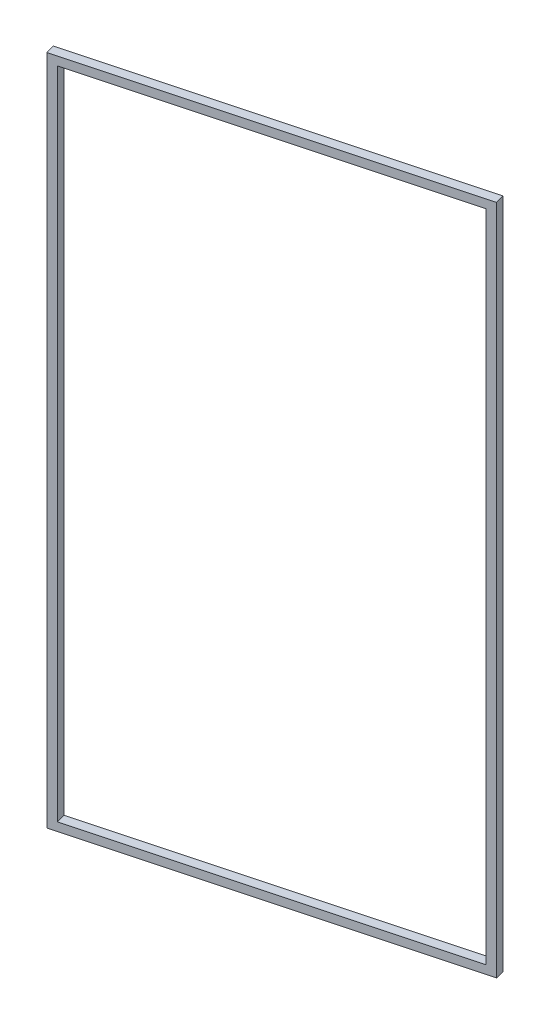
ISO-10303-21;
HEADER;
FILE_DESCRIPTION(('STEP AP214'),'2;1');
FILE_NAME('part.step','',(''),(''),'','','');
FILE_SCHEMA(('AUTOMOTIVE_DESIGN { 1 0 10303 214 1 1 1 1 }'));
ENDSEC;
DATA;
#1=APPLICATION_CONTEXT('core data for automotive mechanical design processes');
#2=APPLICATION_PROTOCOL_DEFINITION('international standard','automotive_design',2000,#1);
#3=PRODUCT_CONTEXT('',#1,'mechanical');
#4=PRODUCT('Part','Part','',(#3));
#5=PRODUCT_RELATED_PRODUCT_CATEGORY('part','',(#4));
#6=PRODUCT_DEFINITION_FORMATION('','',#4);
#7=PRODUCT_DEFINITION_CONTEXT('part definition',#1,'design');
#8=PRODUCT_DEFINITION('design','',#6,#7);
#9=PRODUCT_DEFINITION_SHAPE('','',#8);
#10=(LENGTH_UNIT() NAMED_UNIT(*) SI_UNIT(.MILLI.,.METRE.));
#11=(NAMED_UNIT(*) PLANE_ANGLE_UNIT() SI_UNIT($,.RADIAN.));
#12=(NAMED_UNIT(*) SI_UNIT($,.STERADIAN.) SOLID_ANGLE_UNIT());
#13=UNCERTAINTY_MEASURE_WITH_UNIT(LENGTH_MEASURE(1.E-05),#10,'distance_accuracy_value','');
#14=(GEOMETRIC_REPRESENTATION_CONTEXT(3) GLOBAL_UNCERTAINTY_ASSIGNED_CONTEXT((#13)) GLOBAL_UNIT_ASSIGNED_CONTEXT((#10,
#11,#12)) REPRESENTATION_CONTEXT('',''));
#15=CARTESIAN_POINT('',(0.,0.,0.));
#16=DIRECTION('',(0.,0.,1.));
#17=DIRECTION('',(1.,0.,0.));
#18=AXIS2_PLACEMENT_3D('',#15,#16,#17);
#19=CARTESIAN_POINT('',(-634.689419846,-1202.,2942.296134476));
#20=DIRECTION('',(0.258819045102985,0.,0.965925826288944));
#21=DIRECTION('',(0.,-1.,0.));
#22=AXIS2_PLACEMENT_3D('',#19,#20,#21);
#23=PLANE('',#22);
#24=DIRECTION('',(0.,-1.,0.));
#25=VECTOR('',#24,1.);
#26=CARTESIAN_POINT('',(-1235.012320885,-40.,3103.152171008));
#27=LINE('',#26,#25);
#28=CARTESIAN_POINT('',(-1235.012320885,-40.,3103.152171008));
#29=VERTEX_POINT('',#28);
#30=CARTESIAN_POINT('',(-1235.012320885,-2364.,3103.152171008));
#31=VERTEX_POINT('',#30);
#32=EDGE_CURVE('E158',#29,#31,#27,.T.);
#33=ORIENTED_EDGE('',*,*,#32,.F.);
#34=DIRECTION('',(-0.965925826288944,0.,0.258819045102985));
#35=VECTOR('',#34,1.);
#36=CARTESIAN_POINT('',(-34.36651880737,-40.,2781.440097945));
#37=LINE('',#36,#35);
#38=CARTESIAN_POINT('',(-34.36651880737,-40.,2781.440097945));
#39=VERTEX_POINT('',#38);
#40=EDGE_CURVE('E154',#39,#29,#37,.T.);
#41=ORIENTED_EDGE('',*,*,#40,.F.);
#42=DIRECTION('',(0.,1.,0.));
#43=VECTOR('',#42,1.);
#44=CARTESIAN_POINT('',(-34.36651880737,-2364.,2781.440097945));
#45=LINE('',#44,#43);
#46=CARTESIAN_POINT('',(-34.36651880737,-2364.,2781.440097945));
#47=VERTEX_POINT('',#46);
#48=EDGE_CURVE('E189',#47,#39,#45,.T.);
#49=ORIENTED_EDGE('',*,*,#48,.F.);
#50=DIRECTION('',(0.965925826288944,0.,-0.258819045102985));
#51=VECTOR('',#50,1.);
#52=CARTESIAN_POINT('',(-1235.012320885,-2364.,3103.152171008));
#53=LINE('',#52,#51);
#54=EDGE_CURVE('E21',#31,#47,#53,.T.);
#55=ORIENTED_EDGE('',*,*,#54,.F.);
#56=EDGE_LOOP('',(#33,#41,#49,#55));
#57=FACE_BOUND('',#56,.T.);
#58=DIRECTION('',(0.965925826288944,0.,-0.258819045102985));
#59=VECTOR('',#58,1.);
#60=CARTESIAN_POINT('',(-1263.990095673,-2394.,3110.916742361));
#61=LINE('',#60,#59);
#62=CARTESIAN_POINT('',(-1263.990095673,-2394.,3110.916742361));
#63=VERTEX_POINT('',#62);
#64=CARTESIAN_POINT('',(-5.388744018699,-2394.,2773.675526592));
#65=VERTEX_POINT('',#64);
#66=EDGE_CURVE('E124',#63,#65,#61,.T.);
#67=ORIENTED_EDGE('',*,*,#66,.T.);
#68=DIRECTION('',(0.,1.,0.));
#69=VECTOR('',#68,1.);
#70=CARTESIAN_POINT('',(-5.388744018699,-2394.,2773.675526592));
#71=LINE('',#70,#69);
#72=CARTESIAN_POINT('',(-5.388744018699,-10.,2773.675526592));
#73=VERTEX_POINT('',#72);
#74=EDGE_CURVE('E142',#65,#73,#71,.T.);
#75=ORIENTED_EDGE('',*,*,#74,.T.);
#76=DIRECTION('',(-0.965925826288944,0.,0.258819045102985));
#77=VECTOR('',#76,1.);
#78=CARTESIAN_POINT('',(-5.388744018699,-10.,2773.675526592));
#79=LINE('',#78,#77);
#80=CARTESIAN_POINT('',(-1263.990095673,-10.,3110.916742361));
#81=VERTEX_POINT('',#80);
#82=EDGE_CURVE('E116',#73,#81,#79,.T.);
#83=ORIENTED_EDGE('',*,*,#82,.T.);
#84=DIRECTION('',(0.,-1.,0.));
#85=VECTOR('',#84,1.);
#86=CARTESIAN_POINT('',(-1263.990095673,-10.,3110.916742361));
#87=LINE('',#86,#85);
#88=EDGE_CURVE('E115',#81,#63,#87,.T.);
#89=ORIENTED_EDGE('',*,*,#88,.T.);
#90=EDGE_LOOP('',(#67,#75,#83,#89));
#91=FACE_BOUND('',#90,.T.);
#92=ADVANCED_FACE('F17',(#57,#91),#23,.T.);
#93=CARTESIAN_POINT('',(-643.2304483344,-1202.,2910.420582209));
#94=DIRECTION('',(0.258819045102985,0.,0.965925826288944));
#95=DIRECTION('',(0.,-1.,0.));
#96=AXIS2_PLACEMENT_3D('',#93,#94,#95);
#97=PLANE('',#96);
#98=DIRECTION('',(0.965925826288944,0.,-0.258819045102985));
#99=VECTOR('',#98,1.);
#100=CARTESIAN_POINT('',(-1243.553349373,-2364.,3071.27661874));
#101=LINE('',#100,#99);
#102=CARTESIAN_POINT('',(-1243.553349373,-2364.,3071.27661874));
#103=VERTEX_POINT('',#102);
#104=CARTESIAN_POINT('',(-42.90754729575,-2364.,2749.564545678));
#105=VERTEX_POINT('',#104);
#106=EDGE_CURVE('E11',#103,#105,#101,.T.);
#107=ORIENTED_EDGE('',*,*,#106,.T.);
#108=DIRECTION('',(0.,1.,0.));
#109=VECTOR('',#108,1.);
#110=CARTESIAN_POINT('',(-42.90754729575,-2364.,2749.564545678));
#111=LINE('',#110,#109);
#112=CARTESIAN_POINT('',(-42.90754729575,-40.,2749.564545678));
#113=VERTEX_POINT('',#112);
#114=EDGE_CURVE('E191',#105,#113,#111,.T.);
#115=ORIENTED_EDGE('',*,*,#114,.T.);
#116=DIRECTION('',(-0.965925826288944,0.,0.258819045102985));
#117=VECTOR('',#116,1.);
#118=CARTESIAN_POINT('',(-42.90754729575,-40.,2749.564545678));
#119=LINE('',#118,#117);
#120=CARTESIAN_POINT('',(-1243.553349373,-40.,3071.27661874));
#121=VERTEX_POINT('',#120);
#122=EDGE_CURVE('E150',#113,#121,#119,.T.);
#123=ORIENTED_EDGE('',*,*,#122,.T.);
#124=DIRECTION('',(0.,-1.,0.));
#125=VECTOR('',#124,1.);
#126=CARTESIAN_POINT('',(-1243.553349373,-40.,3071.27661874));
#127=LINE('',#126,#125);
#128=EDGE_CURVE('E166',#121,#103,#127,.T.);
#129=ORIENTED_EDGE('',*,*,#128,.T.);
#130=EDGE_LOOP('',(#107,#115,#123,#129));
#131=FACE_BOUND('',#130,.T.);
#132=DIRECTION('',(0.,-1.,0.));
#133=VECTOR('',#132,1.);
#134=CARTESIAN_POINT('',(-1272.531124162,-10.,3079.041190093));
#135=LINE('',#134,#133);
#136=CARTESIAN_POINT('',(-1272.531124162,-10.,3079.041190093));
#137=VERTEX_POINT('',#136);
#138=CARTESIAN_POINT('',(-1272.531124162,-2394.,3079.041190093));
#139=VERTEX_POINT('',#138);
#140=EDGE_CURVE('E103',#137,#139,#135,.T.);
#141=ORIENTED_EDGE('',*,*,#140,.F.);
#142=DIRECTION('',(-0.965925826288944,0.,0.258819045102985));
#143=VECTOR('',#142,1.);
#144=CARTESIAN_POINT('',(-13.92977250708,-10.,2741.799974325));
#145=LINE('',#144,#143);
#146=CARTESIAN_POINT('',(-13.92977250708,-10.,2741.799974325));
#147=VERTEX_POINT('',#146);
#148=EDGE_CURVE('E146',#147,#137,#145,.T.);
#149=ORIENTED_EDGE('',*,*,#148,.F.);
#150=DIRECTION('',(0.,1.,0.));
#151=VECTOR('',#150,1.);
#152=CARTESIAN_POINT('',(-13.92977250708,-2394.,2741.799974325));
#153=LINE('',#152,#151);
#154=CARTESIAN_POINT('',(-13.92977250708,-2394.,2741.799974325));
#155=VERTEX_POINT('',#154);
#156=EDGE_CURVE('E126',#155,#147,#153,.T.);
#157=ORIENTED_EDGE('',*,*,#156,.F.);
#158=DIRECTION('',(0.965925826288944,0.,-0.258819045102985));
#159=VECTOR('',#158,1.);
#160=CARTESIAN_POINT('',(-1272.531124162,-2394.,3079.041190093));
#161=LINE('',#160,#159);
#162=EDGE_CURVE('E122',#139,#155,#161,.T.);
#163=ORIENTED_EDGE('',*,*,#162,.F.);
#164=EDGE_LOOP('',(#141,#149,#157,#163));
#165=FACE_BOUND('',#164,.T.);
#166=ADVANCED_FACE('F19',(#131,#165),#97,.F.);
#167=CARTESIAN_POINT('',(-1243.553349373,-2364.,3071.27661874));
#168=DIRECTION('',(0.,1.,0.));
#169=DIRECTION('',(1.,0.,0.));
#170=AXIS2_PLACEMENT_3D('',#167,#168,#169);
#171=PLANE('',#170);
#172=DIRECTION('',(0.258819045102985,0.,0.965925826288944));
#173=VECTOR('',#172,1.);
#174=CARTESIAN_POINT('',(-1243.553349373,-2364.,3071.27661874));
#175=LINE('',#174,#173);
#176=EDGE_CURVE('E163',#103,#31,#175,.T.);
#177=ORIENTED_EDGE('',*,*,#176,.T.);
#178=ORIENTED_EDGE('',*,*,#54,.T.);
#179=DIRECTION('',(0.258819045102985,0.,0.965925826288944));
#180=VECTOR('',#179,1.);
#181=CARTESIAN_POINT('',(-42.90754729575,-2364.,2749.564545678));
#182=LINE('',#181,#180);
#183=EDGE_CURVE('E153',#105,#47,#182,.T.);
#184=ORIENTED_EDGE('',*,*,#183,.F.);
#185=ORIENTED_EDGE('',*,*,#106,.F.);
#186=EDGE_LOOP('',(#177,#178,#184,#185));
#187=FACE_BOUND('',#186,.T.);
#188=ADVANCED_FACE('F273',(#187),#171,.T.);
#189=CARTESIAN_POINT('',(-42.90754729575,-2364.,2749.564545678));
#190=DIRECTION('',(-0.965925826288944,0.,0.258819045102985));
#191=DIRECTION('',(0.,1.,0.));
#192=AXIS2_PLACEMENT_3D('',#189,#190,#191);
#193=PLANE('',#192);
#194=ORIENTED_EDGE('',*,*,#183,.T.);
#195=ORIENTED_EDGE('',*,*,#48,.T.);
#196=DIRECTION('',(0.258819045102985,0.,0.965925826288944));
#197=VECTOR('',#196,1.);
#198=CARTESIAN_POINT('',(-42.90754729575,-40.,2749.564545678));
#199=LINE('',#198,#197);
#200=EDGE_CURVE('E180',#113,#39,#199,.T.);
#201=ORIENTED_EDGE('',*,*,#200,.F.);
#202=ORIENTED_EDGE('',*,*,#114,.F.);
#203=EDGE_LOOP('',(#194,#195,#201,#202));
#204=FACE_BOUND('',#203,.T.);
#205=ADVANCED_FACE('F264',(#204),#193,.T.);
#206=CARTESIAN_POINT('',(-42.90754729575,-40.,2749.564545678));
#207=DIRECTION('',(0.,-1.,0.));
#208=DIRECTION('',(0.,0.,-1.));
#209=AXIS2_PLACEMENT_3D('',#206,#207,#208);
#210=PLANE('',#209);
#211=ORIENTED_EDGE('',*,*,#200,.T.);
#212=ORIENTED_EDGE('',*,*,#40,.T.);
#213=DIRECTION('',(0.258819045102985,0.,0.965925826288944));
#214=VECTOR('',#213,1.);
#215=CARTESIAN_POINT('',(-1243.553349373,-40.,3071.27661874));
#216=LINE('',#215,#214);
#217=EDGE_CURVE('E140',#121,#29,#216,.T.);
#218=ORIENTED_EDGE('',*,*,#217,.F.);
#219=ORIENTED_EDGE('',*,*,#122,.F.);
#220=EDGE_LOOP('',(#211,#212,#218,#219));
#221=FACE_BOUND('',#220,.T.);
#222=ADVANCED_FACE('F253',(#221),#210,.T.);
#223=CARTESIAN_POINT('',(-1243.553349373,-40.,3071.27661874));
#224=DIRECTION('',(0.965925826288944,0.,-0.258819045102985));
#225=DIRECTION('',(0.,-1.,0.));
#226=AXIS2_PLACEMENT_3D('',#223,#224,#225);
#227=PLANE('',#226);
#228=ORIENTED_EDGE('',*,*,#217,.T.);
#229=ORIENTED_EDGE('',*,*,#32,.T.);
#230=ORIENTED_EDGE('',*,*,#176,.F.);
#231=ORIENTED_EDGE('',*,*,#128,.F.);
#232=EDGE_LOOP('',(#228,#229,#230,#231));
#233=FACE_BOUND('',#232,.T.);
#234=ADVANCED_FACE('F244',(#233),#227,.T.);
#235=CARTESIAN_POINT('',(-1272.531124162,-10.,3079.041190093));
#236=DIRECTION('',(0.965925826288944,0.,-0.258819045102985));
#237=DIRECTION('',(0.,-1.,0.));
#238=AXIS2_PLACEMENT_3D('',#235,#236,#237);
#239=PLANE('',#238);
#240=ORIENTED_EDGE('',*,*,#140,.T.);
#241=DIRECTION('',(0.258819045102985,0.,0.965925826288944));
#242=VECTOR('',#241,1.);
#243=CARTESIAN_POINT('',(-1272.531124162,-2394.,3079.041190093));
#244=LINE('',#243,#242);
#245=EDGE_CURVE('E107',#139,#63,#244,.T.);
#246=ORIENTED_EDGE('',*,*,#245,.T.);
#247=ORIENTED_EDGE('',*,*,#88,.F.);
#248=DIRECTION('',(0.258819045102985,0.,0.965925826288944));
#249=VECTOR('',#248,1.);
#250=CARTESIAN_POINT('',(-1272.531124162,-10.,3079.041190093));
#251=LINE('',#250,#249);
#252=EDGE_CURVE('E110',#137,#81,#251,.T.);
#253=ORIENTED_EDGE('',*,*,#252,.F.);
#254=EDGE_LOOP('',(#240,#246,#247,#253));
#255=FACE_BOUND('',#254,.T.);
#256=ADVANCED_FACE('F105',(#255),#239,.F.);
#257=CARTESIAN_POINT('',(-13.92977250708,-10.,2741.799974325));
#258=DIRECTION('',(0.,-1.,0.));
#259=DIRECTION('',(0.,0.,-1.));
#260=AXIS2_PLACEMENT_3D('',#257,#258,#259);
#261=PLANE('',#260);
#262=ORIENTED_EDGE('',*,*,#148,.T.);
#263=ORIENTED_EDGE('',*,*,#252,.T.);
#264=ORIENTED_EDGE('',*,*,#82,.F.);
#265=DIRECTION('',(0.258819045102985,0.,0.965925826288944));
#266=VECTOR('',#265,1.);
#267=CARTESIAN_POINT('',(-13.92977250708,-10.,2741.799974325));
#268=LINE('',#267,#266);
#269=EDGE_CURVE('E147',#147,#73,#268,.T.);
#270=ORIENTED_EDGE('',*,*,#269,.F.);
#271=EDGE_LOOP('',(#262,#263,#264,#270));
#272=FACE_BOUND('',#271,.T.);
#273=ADVANCED_FACE('F225',(#272),#261,.F.);
#274=CARTESIAN_POINT('',(-13.92977250708,-2394.,2741.799974325));
#275=DIRECTION('',(-0.965925826288944,0.,0.258819045102985));
#276=DIRECTION('',(0.,1.,0.));
#277=AXIS2_PLACEMENT_3D('',#274,#275,#276);
#278=PLANE('',#277);
#279=ORIENTED_EDGE('',*,*,#156,.T.);
#280=ORIENTED_EDGE('',*,*,#269,.T.);
#281=ORIENTED_EDGE('',*,*,#74,.F.);
#282=DIRECTION('',(0.258819045102985,0.,0.965925826288944));
#283=VECTOR('',#282,1.);
#284=CARTESIAN_POINT('',(-13.92977250708,-2394.,2741.799974325));
#285=LINE('',#284,#283);
#286=EDGE_CURVE('E131',#155,#65,#285,.T.);
#287=ORIENTED_EDGE('',*,*,#286,.F.);
#288=EDGE_LOOP('',(#279,#280,#281,#287));
#289=FACE_BOUND('',#288,.T.);
#290=ADVANCED_FACE('F215',(#289),#278,.F.);
#291=CARTESIAN_POINT('',(-1272.531124162,-2394.,3079.041190093));
#292=DIRECTION('',(0.,1.,0.));
#293=DIRECTION('',(1.,0.,0.));
#294=AXIS2_PLACEMENT_3D('',#291,#292,#293);
#295=PLANE('',#294);
#296=ORIENTED_EDGE('',*,*,#162,.T.);
#297=ORIENTED_EDGE('',*,*,#286,.T.);
#298=ORIENTED_EDGE('',*,*,#66,.F.);
#299=ORIENTED_EDGE('',*,*,#245,.F.);
#300=EDGE_LOOP('',(#296,#297,#298,#299));
#301=FACE_BOUND('',#300,.T.);
#302=ADVANCED_FACE('F120',(#301),#295,.F.);
#303=CLOSED_SHELL('',(#92,#166,#188,#205,#222,#234,#256,#273,#290,#302));
#304=MANIFOLD_SOLID_BREP('B1',#303);
#305=ADVANCED_BREP_SHAPE_REPRESENTATION('',(#18,#304),#14);
#306=SHAPE_DEFINITION_REPRESENTATION(#9,#305);
ENDSEC;
END-ISO-10303-21;
